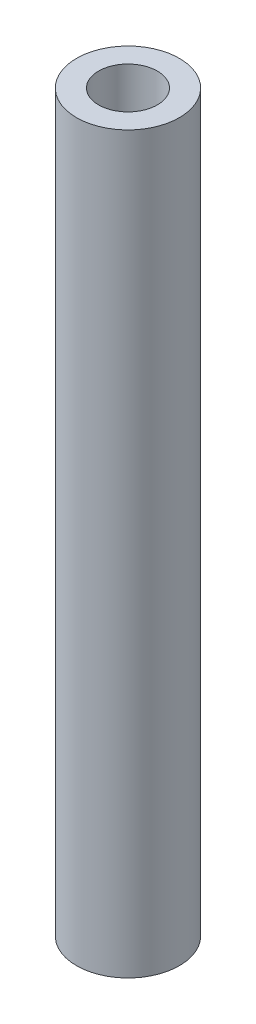
ISO-10303-21;
HEADER;
FILE_DESCRIPTION(('STEP AP214'),'2;1');
FILE_NAME('part.step','',(''),(''),'','','');
FILE_SCHEMA(('AUTOMOTIVE_DESIGN { 1 0 10303 214 1 1 1 1 }'));
ENDSEC;
DATA;
#1=APPLICATION_CONTEXT('core data for automotive mechanical design processes');
#2=APPLICATION_PROTOCOL_DEFINITION('international standard','automotive_design',2000,#1);
#3=PRODUCT_CONTEXT('',#1,'mechanical');
#4=PRODUCT('Part','Part','',(#3));
#5=PRODUCT_RELATED_PRODUCT_CATEGORY('part','',(#4));
#6=PRODUCT_DEFINITION_FORMATION('','',#4);
#7=PRODUCT_DEFINITION_CONTEXT('part definition',#1,'design');
#8=PRODUCT_DEFINITION('design','',#6,#7);
#9=PRODUCT_DEFINITION_SHAPE('','',#8);
#10=(LENGTH_UNIT() NAMED_UNIT(*) SI_UNIT(.MILLI.,.METRE.));
#11=(NAMED_UNIT(*) PLANE_ANGLE_UNIT() SI_UNIT($,.RADIAN.));
#12=(NAMED_UNIT(*) SI_UNIT($,.STERADIAN.) SOLID_ANGLE_UNIT());
#13=UNCERTAINTY_MEASURE_WITH_UNIT(LENGTH_MEASURE(1.E-05),#10,'distance_accuracy_value','');
#14=(GEOMETRIC_REPRESENTATION_CONTEXT(3) GLOBAL_UNCERTAINTY_ASSIGNED_CONTEXT((#13)) GLOBAL_UNIT_ASSIGNED_CONTEXT((#10,
#11,#12)) REPRESENTATION_CONTEXT('',''));
#15=CARTESIAN_POINT('',(0.,0.,0.));
#16=DIRECTION('',(0.,0.,1.));
#17=DIRECTION('',(1.,0.,0.));
#18=AXIS2_PLACEMENT_3D('',#15,#16,#17);
#19=CARTESIAN_POINT('',(0.,50.,0.));
#20=DIRECTION('',(0.,1.,0.));
#21=DIRECTION('',(0.,0.,1.));
#22=AXIS2_PLACEMENT_3D('',#19,#20,#21);
#23=PLANE('',#22);
#24=CARTESIAN_POINT('',(0.,50.,0.));
#25=DIRECTION('',(0.,1.,0.));
#26=DIRECTION('',(0.,0.,1.));
#27=AXIS2_PLACEMENT_3D('',#24,#25,#26);
#28=CIRCLE('',#27,3.5);
#29=CARTESIAN_POINT('',(0.,50.,3.5));
#30=VERTEX_POINT('',#29);
#31=EDGE_CURVE('E10',#30,#30,#28,.T.);
#32=ORIENTED_EDGE('',*,*,#31,.T.);
#33=EDGE_LOOP('',(#32));
#34=FACE_BOUND('',#33,.T.);
#35=CARTESIAN_POINT('',(0.,50.,0.));
#36=DIRECTION('',(0.,1.,0.));
#37=DIRECTION('',(0.,0.,1.));
#38=AXIS2_PLACEMENT_3D('',#35,#36,#37);
#39=CIRCLE('',#38,2.);
#40=CARTESIAN_POINT('',(0.,50.,2.));
#41=VERTEX_POINT('',#40);
#42=EDGE_CURVE('E44',#41,#41,#39,.T.);
#43=ORIENTED_EDGE('',*,*,#42,.F.);
#44=EDGE_LOOP('',(#43));
#45=FACE_BOUND('',#44,.T.);
#46=ADVANCED_FACE('F33',(#34,#45),#23,.T.);
#47=CARTESIAN_POINT('',(0.,0.,0.));
#48=DIRECTION('',(0.,1.,0.));
#49=DIRECTION('',(0.,0.,1.));
#50=AXIS2_PLACEMENT_3D('',#47,#48,#49);
#51=PLANE('',#50);
#52=CARTESIAN_POINT('',(0.,0.,0.));
#53=DIRECTION('',(0.,1.,0.));
#54=DIRECTION('',(0.,0.,1.));
#55=AXIS2_PLACEMENT_3D('',#52,#53,#54);
#56=CIRCLE('',#55,3.5);
#57=CARTESIAN_POINT('',(0.,0.,3.5));
#58=VERTEX_POINT('',#57);
#59=EDGE_CURVE('E37',#58,#58,#56,.T.);
#60=ORIENTED_EDGE('',*,*,#59,.F.);
#61=EDGE_LOOP('',(#60));
#62=FACE_BOUND('',#61,.T.);
#63=CARTESIAN_POINT('',(0.,0.,0.));
#64=DIRECTION('',(0.,1.,0.));
#65=DIRECTION('',(0.,0.,1.));
#66=AXIS2_PLACEMENT_3D('',#63,#64,#65);
#67=CIRCLE('',#66,2.);
#68=CARTESIAN_POINT('',(0.,0.,2.));
#69=VERTEX_POINT('',#68);
#70=EDGE_CURVE('E46',#69,#69,#67,.T.);
#71=ORIENTED_EDGE('',*,*,#70,.T.);
#72=EDGE_LOOP('',(#71));
#73=FACE_BOUND('',#72,.T.);
#74=ADVANCED_FACE('F56',(#62,#73),#51,.F.);
#75=CARTESIAN_POINT('',(0.,50.,0.));
#76=DIRECTION('',(0.,-1.,0.));
#77=DIRECTION('',(0.,0.,-1.));
#78=AXIS2_PLACEMENT_3D('',#75,#76,#77);
#79=CYLINDRICAL_SURFACE('',#78,3.5);
#80=ORIENTED_EDGE('',*,*,#31,.F.);
#81=EDGE_LOOP('',(#80));
#82=FACE_BOUND('',#81,.T.);
#83=ORIENTED_EDGE('',*,*,#59,.T.);
#84=EDGE_LOOP('',(#83));
#85=FACE_BOUND('',#84,.T.);
#86=ADVANCED_FACE('F35',(#82,#85),#79,.T.);
#87=CARTESIAN_POINT('',(0.,50.,0.));
#88=DIRECTION('',(0.,-1.,0.));
#89=DIRECTION('',(0.,0.,-1.));
#90=AXIS2_PLACEMENT_3D('',#87,#88,#89);
#91=CYLINDRICAL_SURFACE('',#90,2.);
#92=ORIENTED_EDGE('',*,*,#42,.T.);
#93=EDGE_LOOP('',(#92));
#94=FACE_BOUND('',#93,.T.);
#95=ORIENTED_EDGE('',*,*,#70,.F.);
#96=EDGE_LOOP('',(#95));
#97=FACE_BOUND('',#96,.T.);
#98=ADVANCED_FACE('F52',(#94,#97),#91,.F.);
#99=CLOSED_SHELL('',(#46,#74,#86,#98));
#100=MANIFOLD_SOLID_BREP('B2',#99);
#101=ADVANCED_BREP_SHAPE_REPRESENTATION('',(#18,#100),#14);
#102=SHAPE_DEFINITION_REPRESENTATION(#9,#101);
ENDSEC;
END-ISO-10303-21;
